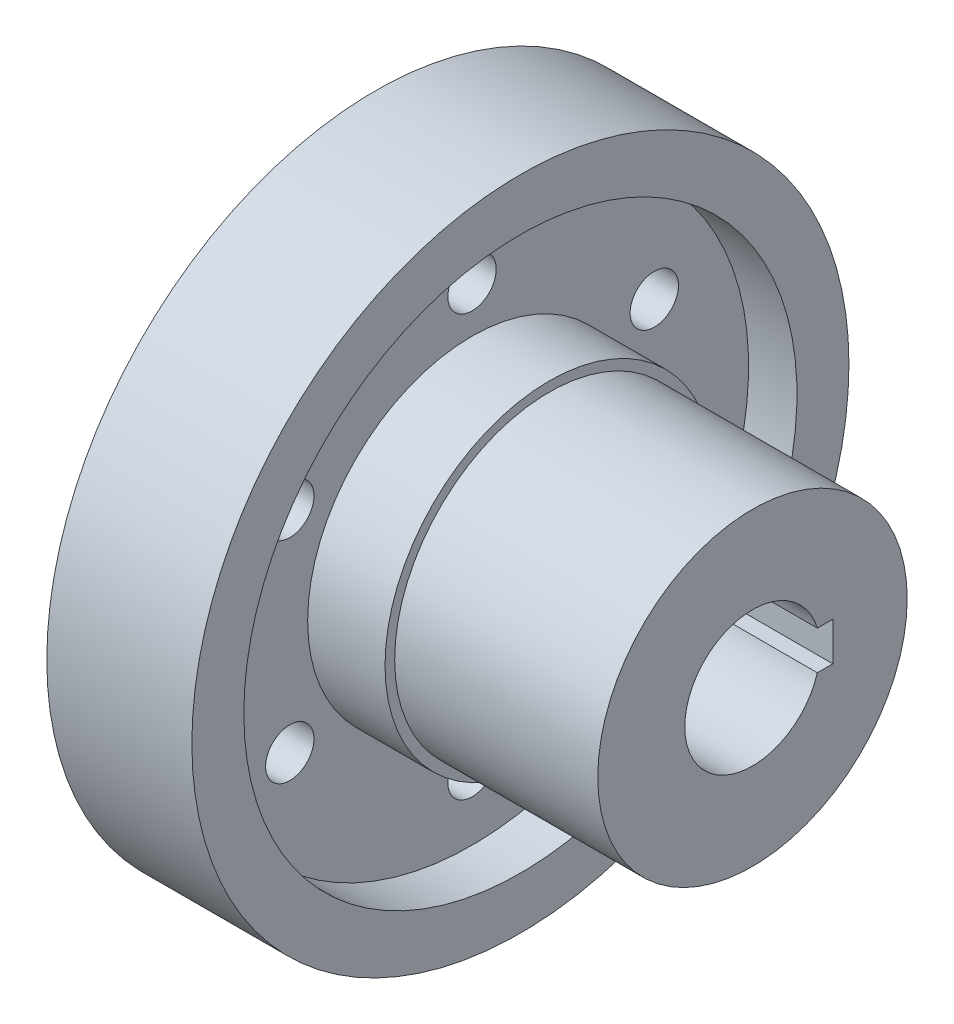
ISO-10303-21;
HEADER;
FILE_DESCRIPTION(('STEP AP214'),'2;1');
FILE_NAME('part.step','',(''),(''),'','','');
FILE_SCHEMA(('AUTOMOTIVE_DESIGN { 1 0 10303 214 1 1 1 1 }'));
ENDSEC;
DATA;
#1=APPLICATION_CONTEXT('core data for automotive mechanical design processes');
#2=APPLICATION_PROTOCOL_DEFINITION('international standard','automotive_design',2000,#1);
#3=PRODUCT_CONTEXT('',#1,'mechanical');
#4=PRODUCT('Part','Part','',(#3));
#5=PRODUCT_RELATED_PRODUCT_CATEGORY('part','',(#4));
#6=PRODUCT_DEFINITION_FORMATION('','',#4);
#7=PRODUCT_DEFINITION_CONTEXT('part definition',#1,'design');
#8=PRODUCT_DEFINITION('design','',#6,#7);
#9=PRODUCT_DEFINITION_SHAPE('','',#8);
#10=(LENGTH_UNIT() NAMED_UNIT(*) SI_UNIT(.MILLI.,.METRE.));
#11=(NAMED_UNIT(*) PLANE_ANGLE_UNIT() SI_UNIT($,.RADIAN.));
#12=(NAMED_UNIT(*) SI_UNIT($,.STERADIAN.) SOLID_ANGLE_UNIT());
#13=UNCERTAINTY_MEASURE_WITH_UNIT(LENGTH_MEASURE(1.E-05),#10,'distance_accuracy_value','');
#14=(GEOMETRIC_REPRESENTATION_CONTEXT(3) GLOBAL_UNCERTAINTY_ASSIGNED_CONTEXT((#13)) GLOBAL_UNIT_ASSIGNED_CONTEXT((#10,
#11,#12)) REPRESENTATION_CONTEXT('',''));
#15=CARTESIAN_POINT('',(0.,0.,0.));
#16=DIRECTION('',(0.,0.,1.));
#17=DIRECTION('',(1.,0.,0.));
#18=AXIS2_PLACEMENT_3D('',#15,#16,#17);
#19=CARTESIAN_POINT('',(-16.7717391304348,0.,-85.));
#20=DIRECTION('',(-1.,0.,0.));
#21=DIRECTION('',(0.,0.,1.));
#22=AXIS2_PLACEMENT_3D('',#19,#20,#21);
#23=PLANE('',#22);
#24=CARTESIAN_POINT('',(-16.7717391304348,108.805263325987,0.));
#25=DIRECTION('',(1.,0.,0.));
#26=DIRECTION('',(0.,0.,-1.));
#27=AXIS2_PLACEMENT_3D('',#24,#25,#26);
#28=CIRCLE('',#27,12.5);
#29=CARTESIAN_POINT('',(-16.7717391304348,108.805263325987,-12.5));
#30=VERTEX_POINT('',#29);
#31=EDGE_CURVE('E182',#30,#30,#28,.T.);
#32=ORIENTED_EDGE('',*,*,#31,.F.);
#33=EDGE_LOOP('',(#32));
#34=FACE_BOUND('',#33,.T.);
#35=CARTESIAN_POINT('',(-16.7717391304348,54.4026316629896,94.2281221057581));
#36=DIRECTION('',(1.,0.,0.));
#37=DIRECTION('',(0.,0.,-1.));
#38=AXIS2_PLACEMENT_3D('',#35,#36,#37);
#39=CIRCLE('',#38,12.5000000000047);
#40=CARTESIAN_POINT('',(-16.7717391304348,54.4026316629896,81.7281221057535));
#41=VERTEX_POINT('',#40);
#42=EDGE_CURVE('E314',#41,#41,#39,.T.);
#43=ORIENTED_EDGE('',*,*,#42,.F.);
#44=EDGE_LOOP('',(#43));
#45=FACE_BOUND('',#44,.T.);
#46=CARTESIAN_POINT('',(-16.7717391304348,-54.4026316629977,94.2281221057535));
#47=DIRECTION('',(1.,0.,0.));
#48=DIRECTION('',(0.,0.,-1.));
#49=AXIS2_PLACEMENT_3D('',#46,#47,#48);
#50=CIRCLE('',#49,12.5000000000088);
#51=CARTESIAN_POINT('',(-16.7717391304348,-54.4026316629977,81.7281221057446));
#52=VERTEX_POINT('',#51);
#53=EDGE_CURVE('E309',#52,#52,#50,.T.);
#54=ORIENTED_EDGE('',*,*,#53,.F.);
#55=EDGE_LOOP('',(#54));
#56=FACE_BOUND('',#55,.T.);
#57=CARTESIAN_POINT('',(-16.7717391304348,-108.805263325987,-9.23575926637093E-12));
#58=DIRECTION('',(1.,0.,0.));
#59=DIRECTION('',(0.,0.,-1.));
#60=AXIS2_PLACEMENT_3D('',#57,#58,#59);
#61=CIRCLE('',#60,12.5000000000096);
#62=CARTESIAN_POINT('',(-16.7717391304348,-108.805263325987,-12.5000000000188));
#63=VERTEX_POINT('',#62);
#64=EDGE_CURVE('E302',#63,#63,#61,.T.);
#65=ORIENTED_EDGE('',*,*,#64,.F.);
#66=EDGE_LOOP('',(#65));
#67=FACE_BOUND('',#66,.T.);
#68=CARTESIAN_POINT('',(-16.7717391304348,54.4026316629977,-94.2281221057627));
#69=DIRECTION('',(1.,0.,0.));
#70=DIRECTION('',(0.,0.,-1.));
#71=AXIS2_PLACEMENT_3D('',#68,#69,#70);
#72=CIRCLE('',#71,12.5000000000013);
#73=CARTESIAN_POINT('',(-16.7717391304348,54.4026316629977,-106.728122105764));
#74=VERTEX_POINT('',#73);
#75=EDGE_CURVE('E301',#74,#74,#72,.T.);
#76=ORIENTED_EDGE('',*,*,#75,.F.);
#77=EDGE_LOOP('',(#76));
#78=FACE_BOUND('',#77,.T.);
#79=CARTESIAN_POINT('',(-16.7717391304348,0.,0.));
#80=DIRECTION('',(-1.,0.,0.));
#81=DIRECTION('',(0.,0.,1.));
#82=AXIS2_PLACEMENT_3D('',#79,#80,#81);
#83=CIRCLE('',#82,143.);
#84=CARTESIAN_POINT('',(-16.7717391304348,0.,143.));
#85=VERTEX_POINT('',#84);
#86=EDGE_CURVE('E155',#85,#85,#83,.T.);
#87=ORIENTED_EDGE('',*,*,#86,.F.);
#88=EDGE_LOOP('',(#87));
#89=FACE_BOUND('',#88,.T.);
#90=CARTESIAN_POINT('',(-16.7717391304348,0.,0.));
#91=DIRECTION('',(-1.,0.,0.));
#92=DIRECTION('',(0.,0.,1.));
#93=AXIS2_PLACEMENT_3D('',#90,#91,#92);
#94=CIRCLE('',#93,85.);
#95=CARTESIAN_POINT('',(-16.7717391304348,0.,85.));
#96=VERTEX_POINT('',#95);
#97=EDGE_CURVE('E159',#96,#96,#94,.T.);
#98=ORIENTED_EDGE('',*,*,#97,.T.);
#99=EDGE_LOOP('',(#98));
#100=FACE_BOUND('',#99,.T.);
#101=CARTESIAN_POINT('',(-16.7717391304348,-54.4026316629897,-94.2281221057673));
#102=DIRECTION('',(1.,0.,0.));
#103=DIRECTION('',(0.,0.,-1.));
#104=AXIS2_PLACEMENT_3D('',#101,#102,#103);
#105=CIRCLE('',#104,12.500000000006);
#106=CARTESIAN_POINT('',(-16.7717391304348,-54.4026316629897,-106.728122105773));
#107=VERTEX_POINT('',#106);
#108=EDGE_CURVE('E298',#107,#107,#105,.T.);
#109=ORIENTED_EDGE('',*,*,#108,.F.);
#110=EDGE_LOOP('',(#109));
#111=FACE_BOUND('',#110,.T.);
#112=ADVANCED_FACE('F41',(#34,#45,#56,#67,#78,#89,#100,#111),#23,.F.);
#113=CARTESIAN_POINT('',(-13.7717391304348,0.,-60.));
#114=DIRECTION('',(1.,0.,0.));
#115=DIRECTION('',(0.,0.,-1.));
#116=AXIS2_PLACEMENT_3D('',#113,#114,#115);
#117=PLANE('',#116);
#118=DIRECTION('',(0.,1.,0.));
#119=VECTOR('',#118,1.);
#120=CARTESIAN_POINT('',(-13.7717391304348,0.,-41.5410196624968));
#121=LINE('',#120,#119);
#122=CARTESIAN_POINT('',(-13.7717391304348,-10.,-41.5410196624968));
#123=VERTEX_POINT('',#122);
#124=CARTESIAN_POINT('',(-13.7717391304348,10.,-41.5410196624968));
#125=VERTEX_POINT('',#124);
#126=EDGE_CURVE('E93',#123,#125,#121,.T.);
#127=ORIENTED_EDGE('',*,*,#126,.T.);
#128=DIRECTION('',(0.,0.,1.));
#129=VECTOR('',#128,1.);
#130=CARTESIAN_POINT('',(-13.7717391304348,10.,-60.));
#131=LINE('',#130,#129);
#132=CARTESIAN_POINT('',(-13.7717391304348,10.,-33.5410196624968));
#133=VERTEX_POINT('',#132);
#134=EDGE_CURVE('E124',#125,#133,#131,.T.);
#135=ORIENTED_EDGE('',*,*,#134,.T.);
#136=CARTESIAN_POINT('',(-13.7717391304348,0.,0.));
#137=DIRECTION('',(-1.,0.,0.));
#138=DIRECTION('',(0.,0.,1.));
#139=AXIS2_PLACEMENT_3D('',#136,#137,#138);
#140=CIRCLE('',#139,35.);
#141=CARTESIAN_POINT('',(-13.7717391304348,-10.,-33.5410196624968));
#142=VERTEX_POINT('',#141);
#143=EDGE_CURVE('E11',#142,#133,#140,.T.);
#144=ORIENTED_EDGE('',*,*,#143,.F.);
#145=DIRECTION('',(0.,0.,-1.));
#146=VECTOR('',#145,1.);
#147=CARTESIAN_POINT('',(-13.7717391304348,-9.99999999999999,-60.));
#148=LINE('',#147,#146);
#149=EDGE_CURVE('E115',#142,#123,#148,.T.);
#150=ORIENTED_EDGE('',*,*,#149,.T.);
#151=EDGE_LOOP('',(#127,#135,#144,#150));
#152=FACE_BOUND('',#151,.T.);
#153=CARTESIAN_POINT('',(-13.7717391304348,0.,0.));
#154=DIRECTION('',(-1.,0.,0.));
#155=DIRECTION('',(0.,0.,1.));
#156=AXIS2_PLACEMENT_3D('',#153,#154,#155);
#157=CIRCLE('',#156,60.);
#158=CARTESIAN_POINT('',(-13.7717391304348,0.,60.));
#159=VERTEX_POINT('',#158);
#160=EDGE_CURVE('E127',#159,#159,#157,.T.);
#161=ORIENTED_EDGE('',*,*,#160,.T.);
#162=EDGE_LOOP('',(#161));
#163=FACE_BOUND('',#162,.T.);
#164=ADVANCED_FACE('F43',(#152,#163),#117,.F.);
#165=CARTESIAN_POINT('',(-159.75,0.,0.));
#166=DIRECTION('',(-1.,0.,0.));
#167=DIRECTION('',(0.,0.,1.));
#168=AXIS2_PLACEMENT_3D('',#165,#166,#167);
#169=CYLINDRICAL_SURFACE('',#168,35.);
#170=ORIENTED_EDGE('',*,*,#143,.T.);
#171=DIRECTION('',(1.,0.,0.));
#172=VECTOR('',#171,1.);
#173=CARTESIAN_POINT('',(-71.7717391304348,10.,-33.5410196624968));
#174=LINE('',#173,#172);
#175=CARTESIAN_POINT('',(128.228260869565,10.,-33.5410196624968));
#176=VERTEX_POINT('',#175);
#177=EDGE_CURVE('E67',#133,#176,#174,.T.);
#178=ORIENTED_EDGE('',*,*,#177,.T.);
#179=CARTESIAN_POINT('',(128.228260869565,0.,0.));
#180=DIRECTION('',(-1.,0.,0.));
#181=DIRECTION('',(0.,0.,1.));
#182=AXIS2_PLACEMENT_3D('',#179,#180,#181);
#183=CIRCLE('',#182,35.);
#184=CARTESIAN_POINT('',(128.228260869565,-10.,-33.5410196624968));
#185=VERTEX_POINT('',#184);
#186=EDGE_CURVE('E51',#185,#176,#183,.T.);
#187=ORIENTED_EDGE('',*,*,#186,.F.);
#188=DIRECTION('',(1.,0.,0.));
#189=VECTOR('',#188,1.);
#190=CARTESIAN_POINT('',(-71.7717391304348,-10.,-33.5410196624968));
#191=LINE('',#190,#189);
#192=EDGE_CURVE('E59',#142,#185,#191,.T.);
#193=ORIENTED_EDGE('',*,*,#192,.F.);
#194=EDGE_LOOP('',(#170,#178,#187,#193));
#195=FACE_BOUND('',#194,.T.);
#196=ADVANCED_FACE('F222',(#195),#169,.F.);
#197=CARTESIAN_POINT('',(128.228260869565,0.,-35.));
#198=DIRECTION('',(-1.,0.,0.));
#199=DIRECTION('',(0.,0.,1.));
#200=AXIS2_PLACEMENT_3D('',#197,#198,#199);
#201=PLANE('',#200);
#202=CARTESIAN_POINT('',(128.228260869565,0.,0.));
#203=DIRECTION('',(-1.,0.,0.));
#204=DIRECTION('',(0.,0.,1.));
#205=AXIS2_PLACEMENT_3D('',#202,#203,#204);
#206=CIRCLE('',#205,80.);
#207=CARTESIAN_POINT('',(128.228260869565,0.,80.));
#208=VERTEX_POINT('',#207);
#209=EDGE_CURVE('E171',#208,#208,#206,.T.);
#210=ORIENTED_EDGE('',*,*,#209,.F.);
#211=EDGE_LOOP('',(#210));
#212=FACE_BOUND('',#211,.T.);
#213=ORIENTED_EDGE('',*,*,#186,.T.);
#214=DIRECTION('',(0.,0.,1.));
#215=VECTOR('',#214,1.);
#216=CARTESIAN_POINT('',(128.228260869565,10.,-33.5410196624968));
#217=LINE('',#216,#215);
#218=CARTESIAN_POINT('',(128.228260869565,10.,-41.5410196624968));
#219=VERTEX_POINT('',#218);
#220=EDGE_CURVE('E106',#219,#176,#217,.T.);
#221=ORIENTED_EDGE('',*,*,#220,.F.);
#222=DIRECTION('',(0.,1.,0.));
#223=VECTOR('',#222,1.);
#224=CARTESIAN_POINT('',(128.228260869565,10.,-41.5410196624968));
#225=LINE('',#224,#223);
#226=CARTESIAN_POINT('',(128.228260869565,-10.,-41.5410196624968));
#227=VERTEX_POINT('',#226);
#228=EDGE_CURVE('E90',#227,#219,#225,.T.);
#229=ORIENTED_EDGE('',*,*,#228,.F.);
#230=DIRECTION('',(0.,0.,-1.));
#231=VECTOR('',#230,1.);
#232=CARTESIAN_POINT('',(128.228260869565,-10.,-33.5410196624968));
#233=LINE('',#232,#231);
#234=EDGE_CURVE('E98',#185,#227,#233,.T.);
#235=ORIENTED_EDGE('',*,*,#234,.F.);
#236=EDGE_LOOP('',(#213,#221,#229,#235));
#237=FACE_BOUND('',#236,.T.);
#238=ADVANCED_FACE('F105',(#212,#237),#201,.F.);
#239=CARTESIAN_POINT('',(-159.75,0.,0.));
#240=DIRECTION('',(-1.,0.,0.));
#241=DIRECTION('',(0.,0.,1.));
#242=AXIS2_PLACEMENT_3D('',#239,#240,#241);
#243=CYLINDRICAL_SURFACE('',#242,80.);
#244=CARTESIAN_POINT('',(23.2282608695652,0.,0.));
#245=DIRECTION('',(-1.,0.,0.));
#246=DIRECTION('',(0.,0.,1.));
#247=AXIS2_PLACEMENT_3D('',#244,#245,#246);
#248=CIRCLE('',#247,80.);
#249=CARTESIAN_POINT('',(23.2282608695652,0.,80.));
#250=VERTEX_POINT('',#249);
#251=EDGE_CURVE('E167',#250,#250,#248,.T.);
#252=ORIENTED_EDGE('',*,*,#251,.F.);
#253=EDGE_LOOP('',(#252));
#254=FACE_BOUND('',#253,.T.);
#255=ORIENTED_EDGE('',*,*,#209,.T.);
#256=EDGE_LOOP('',(#255));
#257=FACE_BOUND('',#256,.T.);
#258=ADVANCED_FACE('F237',(#254,#257),#243,.T.);
#259=CARTESIAN_POINT('',(23.2282608695652,0.,-80.));
#260=DIRECTION('',(-1.,0.,0.));
#261=DIRECTION('',(0.,0.,1.));
#262=AXIS2_PLACEMENT_3D('',#259,#260,#261);
#263=PLANE('',#262);
#264=CARTESIAN_POINT('',(23.2282608695652,0.,0.));
#265=DIRECTION('',(-1.,0.,0.));
#266=DIRECTION('',(0.,0.,1.));
#267=AXIS2_PLACEMENT_3D('',#264,#265,#266);
#268=CIRCLE('',#267,85.);
#269=CARTESIAN_POINT('',(23.2282608695652,0.,85.));
#270=VERTEX_POINT('',#269);
#271=EDGE_CURVE('E163',#270,#270,#268,.T.);
#272=ORIENTED_EDGE('',*,*,#271,.F.);
#273=EDGE_LOOP('',(#272));
#274=FACE_BOUND('',#273,.T.);
#275=ORIENTED_EDGE('',*,*,#251,.T.);
#276=EDGE_LOOP('',(#275));
#277=FACE_BOUND('',#276,.T.);
#278=ADVANCED_FACE('F233',(#274,#277),#263,.F.);
#279=CARTESIAN_POINT('',(-159.75,0.,0.));
#280=DIRECTION('',(-1.,0.,0.));
#281=DIRECTION('',(0.,0.,1.));
#282=AXIS2_PLACEMENT_3D('',#279,#280,#281);
#283=CYLINDRICAL_SURFACE('',#282,85.);
#284=ORIENTED_EDGE('',*,*,#97,.F.);
#285=EDGE_LOOP('',(#284));
#286=FACE_BOUND('',#285,.T.);
#287=ORIENTED_EDGE('',*,*,#271,.T.);
#288=EDGE_LOOP('',(#287));
#289=FACE_BOUND('',#288,.T.);
#290=ADVANCED_FACE('F230',(#286,#289),#283,.T.);
#291=CARTESIAN_POINT('',(-159.75,0.,0.));
#292=DIRECTION('',(-1.,0.,0.));
#293=DIRECTION('',(0.,0.,1.));
#294=AXIS2_PLACEMENT_3D('',#291,#292,#293);
#295=CYLINDRICAL_SURFACE('',#294,143.);
#296=CARTESIAN_POINT('',(8.22826086956524,0.,0.));
#297=DIRECTION('',(-1.,0.,0.));
#298=DIRECTION('',(0.,0.,1.));
#299=AXIS2_PLACEMENT_3D('',#296,#297,#298);
#300=CIRCLE('',#299,143.);
#301=CARTESIAN_POINT('',(8.22826086956524,0.,143.));
#302=VERTEX_POINT('',#301);
#303=EDGE_CURVE('E151',#302,#302,#300,.T.);
#304=ORIENTED_EDGE('',*,*,#303,.F.);
#305=EDGE_LOOP('',(#304));
#306=FACE_BOUND('',#305,.T.);
#307=ORIENTED_EDGE('',*,*,#86,.T.);
#308=EDGE_LOOP('',(#307));
#309=FACE_BOUND('',#308,.T.);
#310=ADVANCED_FACE('F228',(#306,#309),#295,.F.);
#311=CARTESIAN_POINT('',(8.22826086956523,0.,-143.));
#312=DIRECTION('',(-1.,0.,0.));
#313=DIRECTION('',(0.,0.,1.));
#314=AXIS2_PLACEMENT_3D('',#311,#312,#313);
#315=PLANE('',#314);
#316=CARTESIAN_POINT('',(8.22826086956524,0.,0.));
#317=DIRECTION('',(-1.,0.,0.));
#318=DIRECTION('',(0.,0.,1.));
#319=AXIS2_PLACEMENT_3D('',#316,#317,#318);
#320=CIRCLE('',#319,169.875);
#321=CARTESIAN_POINT('',(8.22826086956524,0.,169.875));
#322=VERTEX_POINT('',#321);
#323=EDGE_CURVE('E147',#322,#322,#320,.T.);
#324=ORIENTED_EDGE('',*,*,#323,.F.);
#325=EDGE_LOOP('',(#324));
#326=FACE_BOUND('',#325,.T.);
#327=ORIENTED_EDGE('',*,*,#303,.T.);
#328=EDGE_LOOP('',(#327));
#329=FACE_BOUND('',#328,.T.);
#330=ADVANCED_FACE('F279',(#326,#329),#315,.F.);
#331=CARTESIAN_POINT('',(-159.75,0.,0.));
#332=DIRECTION('',(-1.,0.,0.));
#333=DIRECTION('',(0.,0.,1.));
#334=AXIS2_PLACEMENT_3D('',#331,#332,#333);
#335=CYLINDRICAL_SURFACE('',#334,169.875);
#336=CARTESIAN_POINT('',(-66.7717391304348,0.,0.));
#337=DIRECTION('',(-1.,0.,0.));
#338=DIRECTION('',(0.,0.,1.));
#339=AXIS2_PLACEMENT_3D('',#336,#337,#338);
#340=CIRCLE('',#339,169.875);
#341=CARTESIAN_POINT('',(-66.7717391304348,0.,169.875));
#342=VERTEX_POINT('',#341);
#343=EDGE_CURVE('E143',#342,#342,#340,.T.);
#344=ORIENTED_EDGE('',*,*,#343,.F.);
#345=EDGE_LOOP('',(#344));
#346=FACE_BOUND('',#345,.T.);
#347=ORIENTED_EDGE('',*,*,#323,.T.);
#348=EDGE_LOOP('',(#347));
#349=FACE_BOUND('',#348,.T.);
#350=ADVANCED_FACE('F277',(#346,#349),#335,.T.);
#351=CARTESIAN_POINT('',(-66.7717391304348,0.,-169.875));
#352=DIRECTION('',(1.,0.,0.));
#353=DIRECTION('',(0.,0.,-1.));
#354=AXIS2_PLACEMENT_3D('',#351,#352,#353);
#355=PLANE('',#354);
#356=CARTESIAN_POINT('',(-66.7717391304348,108.805263325987,0.));
#357=DIRECTION('',(1.,0.,0.));
#358=DIRECTION('',(0.,0.,-1.));
#359=AXIS2_PLACEMENT_3D('',#356,#357,#358);
#360=CIRCLE('',#359,12.5);
#361=CARTESIAN_POINT('',(-66.7717391304348,108.805263325987,-12.5));
#362=VERTEX_POINT('',#361);
#363=EDGE_CURVE('E45',#362,#362,#360,.T.);
#364=ORIENTED_EDGE('',*,*,#363,.T.);
#365=EDGE_LOOP('',(#364));
#366=FACE_BOUND('',#365,.T.);
#367=CARTESIAN_POINT('',(-66.7717391304348,54.4026316629896,94.2281221057581));
#368=DIRECTION('',(1.,0.,0.));
#369=DIRECTION('',(0.,0.,-1.));
#370=AXIS2_PLACEMENT_3D('',#367,#368,#369);
#371=CIRCLE('',#370,12.5000000000047);
#372=CARTESIAN_POINT('',(-66.7717391304348,54.4026316629896,81.7281221057535));
#373=VERTEX_POINT('',#372);
#374=EDGE_CURVE('E193',#373,#373,#371,.T.);
#375=ORIENTED_EDGE('',*,*,#374,.T.);
#376=EDGE_LOOP('',(#375));
#377=FACE_BOUND('',#376,.T.);
#378=CARTESIAN_POINT('',(-66.7717391304348,-54.4026316629977,94.2281221057535));
#379=DIRECTION('',(1.,0.,0.));
#380=DIRECTION('',(0.,0.,-1.));
#381=AXIS2_PLACEMENT_3D('',#378,#379,#380);
#382=CIRCLE('',#381,12.5000000000088);
#383=CARTESIAN_POINT('',(-66.7717391304348,-54.4026316629977,81.7281221057446));
#384=VERTEX_POINT('',#383);
#385=EDGE_CURVE('E190',#384,#384,#382,.T.);
#386=ORIENTED_EDGE('',*,*,#385,.T.);
#387=EDGE_LOOP('',(#386));
#388=FACE_BOUND('',#387,.T.);
#389=CARTESIAN_POINT('',(-66.7717391304348,-108.805263325987,-9.23575926637093E-12));
#390=DIRECTION('',(1.,0.,0.));
#391=DIRECTION('',(0.,0.,-1.));
#392=AXIS2_PLACEMENT_3D('',#389,#390,#391);
#393=CIRCLE('',#392,12.5000000000096);
#394=CARTESIAN_POINT('',(-66.7717391304348,-108.805263325987,-12.5000000000188));
#395=VERTEX_POINT('',#394);
#396=EDGE_CURVE('E186',#395,#395,#393,.T.);
#397=ORIENTED_EDGE('',*,*,#396,.T.);
#398=EDGE_LOOP('',(#397));
#399=FACE_BOUND('',#398,.T.);
#400=CARTESIAN_POINT('',(-66.7717391304348,-54.4026316629897,-94.2281221057673));
#401=DIRECTION('',(1.,0.,0.));
#402=DIRECTION('',(0.,0.,-1.));
#403=AXIS2_PLACEMENT_3D('',#400,#401,#402);
#404=CIRCLE('',#403,12.500000000006);
#405=CARTESIAN_POINT('',(-66.7717391304348,-54.4026316629897,-106.728122105773));
#406=VERTEX_POINT('',#405);
#407=EDGE_CURVE('E181',#406,#406,#404,.T.);
#408=ORIENTED_EDGE('',*,*,#407,.T.);
#409=EDGE_LOOP('',(#408));
#410=FACE_BOUND('',#409,.T.);
#411=CARTESIAN_POINT('',(-66.7717391304348,54.4026316629977,-94.2281221057627));
#412=DIRECTION('',(1.,0.,0.));
#413=DIRECTION('',(0.,0.,-1.));
#414=AXIS2_PLACEMENT_3D('',#411,#412,#413);
#415=CIRCLE('',#414,12.5000000000013);
#416=CARTESIAN_POINT('',(-66.7717391304348,54.4026316629977,-106.728122105764));
#417=VERTEX_POINT('',#416);
#418=EDGE_CURVE('E177',#417,#417,#415,.T.);
#419=ORIENTED_EDGE('',*,*,#418,.T.);
#420=EDGE_LOOP('',(#419));
#421=FACE_BOUND('',#420,.T.);
#422=CARTESIAN_POINT('',(-66.7717391304348,0.,0.));
#423=DIRECTION('',(-1.,0.,0.));
#424=DIRECTION('',(0.,0.,1.));
#425=AXIS2_PLACEMENT_3D('',#422,#423,#424);
#426=CIRCLE('',#425,90.);
#427=CARTESIAN_POINT('',(-66.7717391304348,0.,90.));
#428=VERTEX_POINT('',#427);
#429=EDGE_CURVE('E139',#428,#428,#426,.T.);
#430=ORIENTED_EDGE('',*,*,#429,.F.);
#431=EDGE_LOOP('',(#430));
#432=FACE_BOUND('',#431,.T.);
#433=ORIENTED_EDGE('',*,*,#343,.T.);
#434=EDGE_LOOP('',(#433));
#435=FACE_BOUND('',#434,.T.);
#436=ADVANCED_FACE('F202',(#366,#377,#388,#399,#410,#421,#432,#435),#355,.F.);
#437=CARTESIAN_POINT('',(-159.75,0.,0.));
#438=DIRECTION('',(-1.,0.,0.));
#439=DIRECTION('',(0.,0.,1.));
#440=AXIS2_PLACEMENT_3D('',#437,#438,#439);
#441=CYLINDRICAL_SURFACE('',#440,90.);
#442=CARTESIAN_POINT('',(-71.7717391304348,0.,0.));
#443=DIRECTION('',(-1.,0.,0.));
#444=DIRECTION('',(0.,0.,1.));
#445=AXIS2_PLACEMENT_3D('',#442,#443,#444);
#446=CIRCLE('',#445,90.);
#447=CARTESIAN_POINT('',(-71.7717391304348,0.,90.));
#448=VERTEX_POINT('',#447);
#449=EDGE_CURVE('E135',#448,#448,#446,.T.);
#450=ORIENTED_EDGE('',*,*,#449,.F.);
#451=EDGE_LOOP('',(#450));
#452=FACE_BOUND('',#451,.T.);
#453=ORIENTED_EDGE('',*,*,#429,.T.);
#454=EDGE_LOOP('',(#453));
#455=FACE_BOUND('',#454,.T.);
#456=ADVANCED_FACE('F270',(#452,#455),#441,.T.);
#457=CARTESIAN_POINT('',(-71.7717391304348,0.,-90.));
#458=DIRECTION('',(1.,0.,0.));
#459=DIRECTION('',(0.,0.,-1.));
#460=AXIS2_PLACEMENT_3D('',#457,#458,#459);
#461=PLANE('',#460);
#462=CARTESIAN_POINT('',(-71.7717391304348,0.,0.));
#463=DIRECTION('',(-1.,0.,0.));
#464=DIRECTION('',(0.,0.,1.));
#465=AXIS2_PLACEMENT_3D('',#462,#463,#464);
#466=CIRCLE('',#465,60.);
#467=CARTESIAN_POINT('',(-71.7717391304348,0.,60.));
#468=VERTEX_POINT('',#467);
#469=EDGE_CURVE('E131',#468,#468,#466,.T.);
#470=ORIENTED_EDGE('',*,*,#469,.F.);
#471=EDGE_LOOP('',(#470));
#472=FACE_BOUND('',#471,.T.);
#473=ORIENTED_EDGE('',*,*,#449,.T.);
#474=EDGE_LOOP('',(#473));
#475=FACE_BOUND('',#474,.T.);
#476=ADVANCED_FACE('F259',(#472,#475),#461,.F.);
#477=CARTESIAN_POINT('',(-159.75,0.,0.));
#478=DIRECTION('',(-1.,0.,0.));
#479=DIRECTION('',(0.,0.,1.));
#480=AXIS2_PLACEMENT_3D('',#477,#478,#479);
#481=CYLINDRICAL_SURFACE('',#480,60.);
#482=ORIENTED_EDGE('',*,*,#160,.F.);
#483=EDGE_LOOP('',(#482));
#484=FACE_BOUND('',#483,.T.);
#485=ORIENTED_EDGE('',*,*,#469,.T.);
#486=EDGE_LOOP('',(#485));
#487=FACE_BOUND('',#486,.T.);
#488=ADVANCED_FACE('F252',(#484,#487),#481,.F.);
#489=CARTESIAN_POINT('',(-71.7717391304348,10.,-33.5410196624968));
#490=DIRECTION('',(0.,1.,0.));
#491=DIRECTION('',(0.,0.,1.));
#492=AXIS2_PLACEMENT_3D('',#489,#490,#491);
#493=PLANE('',#492);
#494=DIRECTION('',(1.,0.,0.));
#495=VECTOR('',#494,1.);
#496=CARTESIAN_POINT('',(-71.7717391304348,10.,-41.5410196624968));
#497=LINE('',#496,#495);
#498=EDGE_CURVE('E96',#125,#219,#497,.T.);
#499=ORIENTED_EDGE('',*,*,#498,.T.);
#500=ORIENTED_EDGE('',*,*,#220,.T.);
#501=ORIENTED_EDGE('',*,*,#177,.F.);
#502=ORIENTED_EDGE('',*,*,#134,.F.);
#503=EDGE_LOOP('',(#499,#500,#501,#502));
#504=FACE_BOUND('',#503,.T.);
#505=ADVANCED_FACE('F250',(#504),#493,.F.);
#506=CARTESIAN_POINT('',(-71.7717391304348,10.,-41.5410196624968));
#507=DIRECTION('',(0.,0.,-1.));
#508=DIRECTION('',(-1.,0.,0.));
#509=AXIS2_PLACEMENT_3D('',#506,#507,#508);
#510=PLANE('',#509);
#511=DIRECTION('',(1.,0.,0.));
#512=VECTOR('',#511,1.);
#513=CARTESIAN_POINT('',(-71.7717391304348,-10.,-41.5410196624968));
#514=LINE('',#513,#512);
#515=EDGE_CURVE('E86',#123,#227,#514,.T.);
#516=ORIENTED_EDGE('',*,*,#515,.T.);
#517=ORIENTED_EDGE('',*,*,#228,.T.);
#518=ORIENTED_EDGE('',*,*,#498,.F.);
#519=ORIENTED_EDGE('',*,*,#126,.F.);
#520=EDGE_LOOP('',(#516,#517,#518,#519));
#521=FACE_BOUND('',#520,.T.);
#522=ADVANCED_FACE('F87',(#521),#510,.F.);
#523=CARTESIAN_POINT('',(-71.7717391304348,-10.,-33.5410196624968));
#524=DIRECTION('',(0.,-1.,0.));
#525=DIRECTION('',(0.,0.,-1.));
#526=AXIS2_PLACEMENT_3D('',#523,#524,#525);
#527=PLANE('',#526);
#528=ORIENTED_EDGE('',*,*,#192,.T.);
#529=ORIENTED_EDGE('',*,*,#234,.T.);
#530=ORIENTED_EDGE('',*,*,#515,.F.);
#531=ORIENTED_EDGE('',*,*,#149,.F.);
#532=EDGE_LOOP('',(#528,#529,#530,#531));
#533=FACE_BOUND('',#532,.T.);
#534=ADVANCED_FACE('F99',(#533),#527,.F.);
#535=CARTESIAN_POINT('',(-71.7717391304348,54.4026316629977,-94.2281221057627));
#536=DIRECTION('',(1.,0.,0.));
#537=DIRECTION('',(0.,0.,-1.));
#538=AXIS2_PLACEMENT_3D('',#535,#536,#537);
#539=CYLINDRICAL_SURFACE('',#538,12.5000000000013);
#540=ORIENTED_EDGE('',*,*,#75,.T.);
#541=EDGE_LOOP('',(#540));
#542=FACE_BOUND('',#541,.T.);
#543=ORIENTED_EDGE('',*,*,#418,.F.);
#544=EDGE_LOOP('',(#543));
#545=FACE_BOUND('',#544,.T.);
#546=ADVANCED_FACE('F266',(#542,#545),#539,.F.);
#547=CARTESIAN_POINT('',(-71.7717391304348,-54.4026316629897,-94.2281221057673));
#548=DIRECTION('',(1.,0.,0.));
#549=DIRECTION('',(0.,0.,-1.));
#550=AXIS2_PLACEMENT_3D('',#547,#548,#549);
#551=CYLINDRICAL_SURFACE('',#550,12.500000000006);
#552=ORIENTED_EDGE('',*,*,#108,.T.);
#553=EDGE_LOOP('',(#552));
#554=FACE_BOUND('',#553,.T.);
#555=ORIENTED_EDGE('',*,*,#407,.F.);
#556=EDGE_LOOP('',(#555));
#557=FACE_BOUND('',#556,.T.);
#558=ADVANCED_FACE('F331',(#554,#557),#551,.F.);
#559=CARTESIAN_POINT('',(-71.7717391304348,-108.805263325987,-9.23575926637093E-12));
#560=DIRECTION('',(1.,0.,0.));
#561=DIRECTION('',(0.,0.,-1.));
#562=AXIS2_PLACEMENT_3D('',#559,#560,#561);
#563=CYLINDRICAL_SURFACE('',#562,12.5000000000096);
#564=ORIENTED_EDGE('',*,*,#64,.T.);
#565=EDGE_LOOP('',(#564));
#566=FACE_BOUND('',#565,.T.);
#567=ORIENTED_EDGE('',*,*,#396,.F.);
#568=EDGE_LOOP('',(#567));
#569=FACE_BOUND('',#568,.T.);
#570=ADVANCED_FACE('F344',(#566,#569),#563,.F.);
#571=CARTESIAN_POINT('',(-71.7717391304348,-54.4026316629977,94.2281221057535));
#572=DIRECTION('',(1.,0.,0.));
#573=DIRECTION('',(0.,0.,-1.));
#574=AXIS2_PLACEMENT_3D('',#571,#572,#573);
#575=CYLINDRICAL_SURFACE('',#574,12.5000000000088);
#576=ORIENTED_EDGE('',*,*,#53,.T.);
#577=EDGE_LOOP('',(#576));
#578=FACE_BOUND('',#577,.T.);
#579=ORIENTED_EDGE('',*,*,#385,.F.);
#580=EDGE_LOOP('',(#579));
#581=FACE_BOUND('',#580,.T.);
#582=ADVANCED_FACE('F212',(#578,#581),#575,.F.);
#583=CARTESIAN_POINT('',(-71.7717391304348,54.4026316629896,94.2281221057581));
#584=DIRECTION('',(1.,0.,0.));
#585=DIRECTION('',(0.,0.,-1.));
#586=AXIS2_PLACEMENT_3D('',#583,#584,#585);
#587=CYLINDRICAL_SURFACE('',#586,12.5000000000047);
#588=ORIENTED_EDGE('',*,*,#42,.T.);
#589=EDGE_LOOP('',(#588));
#590=FACE_BOUND('',#589,.T.);
#591=ORIENTED_EDGE('',*,*,#374,.F.);
#592=EDGE_LOOP('',(#591));
#593=FACE_BOUND('',#592,.T.);
#594=ADVANCED_FACE('F206',(#590,#593),#587,.F.);
#595=CARTESIAN_POINT('',(-71.7717391304348,108.805263325987,0.));
#596=DIRECTION('',(1.,0.,0.));
#597=DIRECTION('',(0.,0.,-1.));
#598=AXIS2_PLACEMENT_3D('',#595,#596,#597);
#599=CYLINDRICAL_SURFACE('',#598,12.5);
#600=ORIENTED_EDGE('',*,*,#31,.T.);
#601=EDGE_LOOP('',(#600));
#602=FACE_BOUND('',#601,.T.);
#603=ORIENTED_EDGE('',*,*,#363,.F.);
#604=EDGE_LOOP('',(#603));
#605=FACE_BOUND('',#604,.T.);
#606=ADVANCED_FACE('F204',(#602,#605),#599,.F.);
#607=CLOSED_SHELL('',(#112,#164,#196,#238,#258,#278,#290,#310,#330,#350,#436,#456,#476,#488,
#505,#522,#534,#546,#558,#570,#582,#594,#606));
#608=MANIFOLD_SOLID_BREP('B2',#607);
#609=ADVANCED_BREP_SHAPE_REPRESENTATION('',(#18,#608),#14);
#610=SHAPE_DEFINITION_REPRESENTATION(#9,#609);
ENDSEC;
END-ISO-10303-21;
